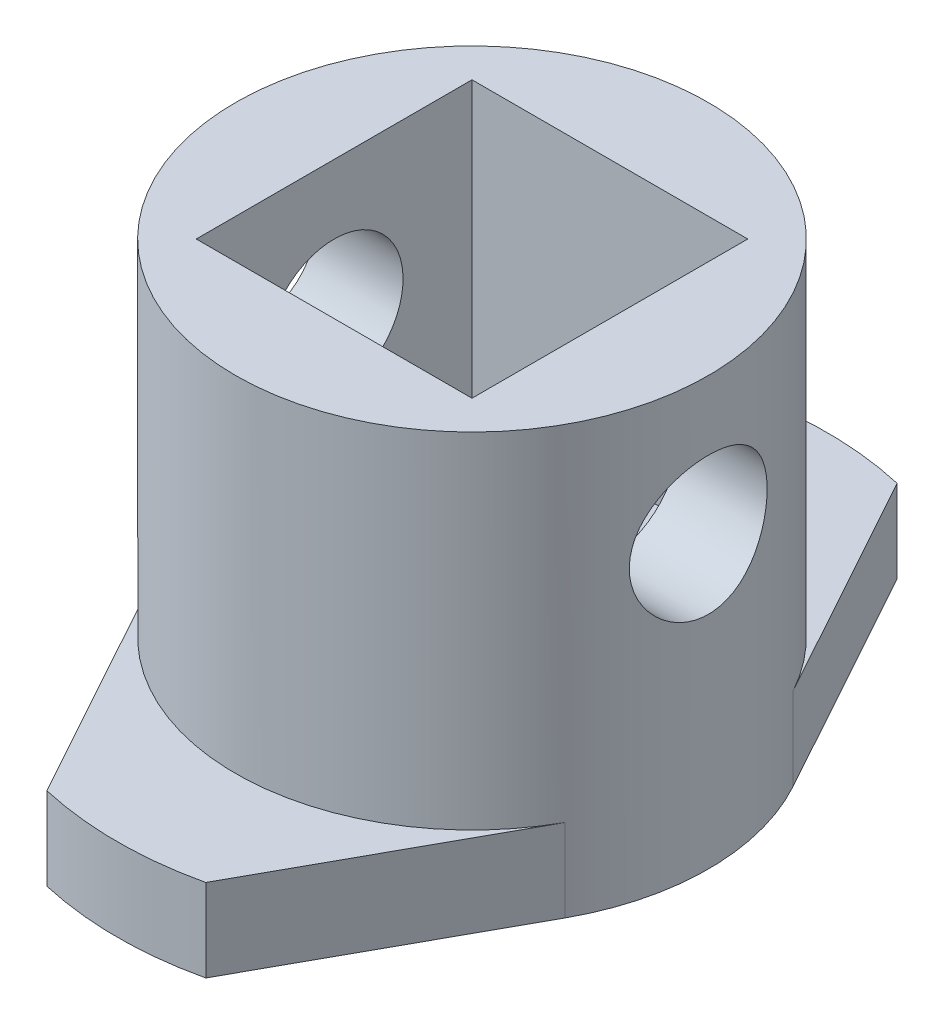
ISO-10303-21;
HEADER;
FILE_DESCRIPTION(('STEP AP214'),'2;1');
FILE_NAME('part.step','',(''),(''),'','','');
FILE_SCHEMA(('AUTOMOTIVE_DESIGN { 1 0 10303 214 1 1 1 1 }'));
ENDSEC;
DATA;
#1=APPLICATION_CONTEXT('core data for automotive mechanical design processes');
#2=APPLICATION_PROTOCOL_DEFINITION('international standard','automotive_design',2000,#1);
#3=PRODUCT_CONTEXT('',#1,'mechanical');
#4=PRODUCT('Part','Part','',(#3));
#5=PRODUCT_RELATED_PRODUCT_CATEGORY('part','',(#4));
#6=PRODUCT_DEFINITION_FORMATION('','',#4);
#7=PRODUCT_DEFINITION_CONTEXT('part definition',#1,'design');
#8=PRODUCT_DEFINITION('design','',#6,#7);
#9=PRODUCT_DEFINITION_SHAPE('','',#8);
#10=(LENGTH_UNIT() NAMED_UNIT(*) SI_UNIT(.MILLI.,.METRE.));
#11=(NAMED_UNIT(*) PLANE_ANGLE_UNIT() SI_UNIT($,.RADIAN.));
#12=(NAMED_UNIT(*) SI_UNIT($,.STERADIAN.) SOLID_ANGLE_UNIT());
#13=UNCERTAINTY_MEASURE_WITH_UNIT(LENGTH_MEASURE(1.E-05),#10,'distance_accuracy_value','');
#14=(GEOMETRIC_REPRESENTATION_CONTEXT(3) GLOBAL_UNCERTAINTY_ASSIGNED_CONTEXT((#13)) GLOBAL_UNIT_ASSIGNED_CONTEXT((#10,
#11,#12)) REPRESENTATION_CONTEXT('',''));
#15=CARTESIAN_POINT('',(0.,0.,0.));
#16=DIRECTION('',(0.,0.,1.));
#17=DIRECTION('',(1.,0.,0.));
#18=AXIS2_PLACEMENT_3D('',#15,#16,#17);
#19=CARTESIAN_POINT('',(0.,2.4,0.));
#20=DIRECTION('',(0.,1.,0.));
#21=DIRECTION('',(0.,0.,1.));
#22=AXIS2_PLACEMENT_3D('',#19,#20,#21);
#23=PLANE('',#22);
#24=CARTESIAN_POINT('',(0.,2.4,0.));
#25=DIRECTION('',(0.,1.,0.));
#26=DIRECTION('',(0.,0.,1.));
#27=AXIS2_PLACEMENT_3D('',#24,#25,#26);
#28=CIRCLE('',#27,6.86);
#29=CARTESIAN_POINT('',(6.00808554165001,2.4,-3.31096785309313));
#30=VERTEX_POINT('',#29);
#31=CARTESIAN_POINT('',(-6.00808554165001,2.4,-3.31096785309313));
#32=VERTEX_POINT('',#31);
#33=EDGE_CURVE('E11',#30,#32,#28,.T.);
#34=ORIENTED_EDGE('',*,*,#33,.F.);
#35=DIRECTION('',(-0.482648375086462,0.,-0.875814218899418));
#36=VECTOR('',#35,1.);
#37=CARTESIAN_POINT('',(6.00808554165001,2.4,-3.31096785309313));
#38=LINE('',#37,#36);
#39=CARTESIAN_POINT('',(2.30631094623362,2.4,-10.0282116959747));
#40=VERTEX_POINT('',#39);
#41=EDGE_CURVE('E112',#30,#40,#38,.T.);
#42=ORIENTED_EDGE('',*,*,#41,.T.);
#43=CARTESIAN_POINT('',(0.,2.4,0.));
#44=DIRECTION('',(0.,1.,0.));
#45=DIRECTION('',(0.,0.,1.));
#46=AXIS2_PLACEMENT_3D('',#43,#44,#45);
#47=CIRCLE('',#46,10.29);
#48=CARTESIAN_POINT('',(-2.30631094623362,2.4,-10.0282116959747));
#49=VERTEX_POINT('',#48);
#50=EDGE_CURVE('E115',#40,#49,#47,.T.);
#51=ORIENTED_EDGE('',*,*,#50,.T.);
#52=DIRECTION('',(-0.482648375086462,0.,0.875814218899418));
#53=VECTOR('',#52,1.);
#54=CARTESIAN_POINT('',(-6.00808554165001,2.4,-3.31096785309313));
#55=LINE('',#54,#53);
#56=EDGE_CURVE('E59',#49,#32,#55,.T.);
#57=ORIENTED_EDGE('',*,*,#56,.T.);
#58=EDGE_LOOP('',(#34,#42,#51,#57));
#59=FACE_BOUND('',#58,.T.);
#60=ADVANCED_FACE('F33',(#59),#23,.T.);
#61=CARTESIAN_POINT('',(-6.00808554165001,2.4,3.31096785309313));
#62=DIRECTION('',(0.875814218899418,0.,-0.482648375086462));
#63=DIRECTION('',(-0.482648375086462,0.,-0.875814218899418));
#64=AXIS2_PLACEMENT_3D('',#61,#62,#63);
#65=PLANE('',#64);
#66=DIRECTION('',(0.482648375086462,0.,0.875814218899418));
#67=VECTOR('',#66,1.);
#68=CARTESIAN_POINT('',(-6.00808554165001,0.,3.31096785309313));
#69=LINE('',#68,#67);
#70=CARTESIAN_POINT('',(-6.00808554165001,0.,3.31096785309313));
#71=VERTEX_POINT('',#70);
#72=CARTESIAN_POINT('',(-2.30631094623362,0.,10.0282116959747));
#73=VERTEX_POINT('',#72);
#74=EDGE_CURVE('E143',#71,#73,#69,.T.);
#75=ORIENTED_EDGE('',*,*,#74,.T.);
#76=DIRECTION('',(0.,-1.,0.));
#77=VECTOR('',#76,1.);
#78=CARTESIAN_POINT('',(-2.30631094623362,2.4,10.0282116959747));
#79=LINE('',#78,#77);
#80=CARTESIAN_POINT('',(-2.30631094623362,2.4,10.0282116959747));
#81=VERTEX_POINT('',#80);
#82=EDGE_CURVE('E161',#81,#73,#79,.T.);
#83=ORIENTED_EDGE('',*,*,#82,.F.);
#84=DIRECTION('',(0.482648375086462,0.,0.875814218899418));
#85=VECTOR('',#84,1.);
#86=CARTESIAN_POINT('',(-6.00808554165001,2.4,3.31096785309313));
#87=LINE('',#86,#85);
#88=CARTESIAN_POINT('',(-6.00808554165001,2.4,3.31096785309313));
#89=VERTEX_POINT('',#88);
#90=EDGE_CURVE('E156',#89,#81,#87,.T.);
#91=ORIENTED_EDGE('',*,*,#90,.F.);
#92=DIRECTION('',(0.,-1.,0.));
#93=VECTOR('',#92,1.);
#94=CARTESIAN_POINT('',(-6.00808554165001,2.4,3.31096785309313));
#95=LINE('',#94,#93);
#96=EDGE_CURVE('E165',#89,#71,#95,.T.);
#97=ORIENTED_EDGE('',*,*,#96,.T.);
#98=EDGE_LOOP('',(#75,#83,#91,#97));
#99=FACE_BOUND('',#98,.T.);
#100=ADVANCED_FACE('F35',(#99),#65,.F.);
#101=CARTESIAN_POINT('',(0.,2.4,0.));
#102=DIRECTION('',(0.,-1.,0.));
#103=DIRECTION('',(0.,0.,-1.));
#104=AXIS2_PLACEMENT_3D('',#101,#102,#103);
#105=CYLINDRICAL_SURFACE('',#104,10.29);
#106=CARTESIAN_POINT('',(0.,0.,0.));
#107=DIRECTION('',(0.,1.,0.));
#108=DIRECTION('',(0.,0.,1.));
#109=AXIS2_PLACEMENT_3D('',#106,#107,#108);
#110=CIRCLE('',#109,10.29);
#111=CARTESIAN_POINT('',(2.30631094623362,0.,10.0282116959747));
#112=VERTEX_POINT('',#111);
#113=EDGE_CURVE('E146',#73,#112,#110,.T.);
#114=ORIENTED_EDGE('',*,*,#113,.T.);
#115=DIRECTION('',(0.,-1.,0.));
#116=VECTOR('',#115,1.);
#117=CARTESIAN_POINT('',(2.30631094623362,2.4,10.0282116959747));
#118=LINE('',#117,#116);
#119=CARTESIAN_POINT('',(2.30631094623362,2.4,10.0282116959747));
#120=VERTEX_POINT('',#119);
#121=EDGE_CURVE('E158',#120,#112,#118,.T.);
#122=ORIENTED_EDGE('',*,*,#121,.F.);
#123=CARTESIAN_POINT('',(0.,2.4,0.));
#124=DIRECTION('',(0.,1.,0.));
#125=DIRECTION('',(0.,0.,1.));
#126=AXIS2_PLACEMENT_3D('',#123,#124,#125);
#127=CIRCLE('',#126,10.29);
#128=EDGE_CURVE('E138',#81,#120,#127,.T.);
#129=ORIENTED_EDGE('',*,*,#128,.F.);
#130=ORIENTED_EDGE('',*,*,#82,.T.);
#131=EDGE_LOOP('',(#114,#122,#129,#130));
#132=FACE_BOUND('',#131,.T.);
#133=ADVANCED_FACE('F195',(#132),#105,.T.);
#134=CARTESIAN_POINT('',(6.00808554165001,2.4,3.31096785309313));
#135=DIRECTION('',(-0.875814218899418,0.,-0.482648375086462));
#136=DIRECTION('',(-0.482648375086462,0.,0.875814218899418));
#137=AXIS2_PLACEMENT_3D('',#134,#135,#136);
#138=PLANE('',#137);
#139=DIRECTION('',(0.482648375086462,0.,-0.875814218899418));
#140=VECTOR('',#139,1.);
#141=CARTESIAN_POINT('',(6.00808554165001,0.,3.31096785309313));
#142=LINE('',#141,#140);
#143=CARTESIAN_POINT('',(6.00808554165001,0.,3.31096785309313));
#144=VERTEX_POINT('',#143);
#145=EDGE_CURVE('E148',#112,#144,#142,.T.);
#146=ORIENTED_EDGE('',*,*,#145,.T.);
#147=DIRECTION('',(0.,-1.,0.));
#148=VECTOR('',#147,1.);
#149=CARTESIAN_POINT('',(6.00808554165001,2.4,3.31096785309313));
#150=LINE('',#149,#148);
#151=CARTESIAN_POINT('',(6.00808554165001,2.4,3.31096785309313));
#152=VERTEX_POINT('',#151);
#153=EDGE_CURVE('E162',#152,#144,#150,.T.);
#154=ORIENTED_EDGE('',*,*,#153,.F.);
#155=DIRECTION('',(0.482648375086462,0.,-0.875814218899418));
#156=VECTOR('',#155,1.);
#157=CARTESIAN_POINT('',(6.00808554165001,2.4,3.31096785309313));
#158=LINE('',#157,#156);
#159=EDGE_CURVE('E120',#120,#152,#158,.T.);
#160=ORIENTED_EDGE('',*,*,#159,.F.);
#161=ORIENTED_EDGE('',*,*,#121,.T.);
#162=EDGE_LOOP('',(#146,#154,#160,#161));
#163=FACE_BOUND('',#162,.T.);
#164=ADVANCED_FACE('F199',(#163),#138,.F.);
#165=CARTESIAN_POINT('',(0.,2.4,0.));
#166=DIRECTION('',(0.,-1.,0.));
#167=DIRECTION('',(0.,0.,-1.));
#168=AXIS2_PLACEMENT_3D('',#165,#166,#167);
#169=CYLINDRICAL_SURFACE('',#168,6.86);
#170=CARTESIAN_POINT('',(-6.86,6.4,0.));
#171=CARTESIAN_POINT('',(-6.85999883049594,6.40000170208321,-0.109859500539845));
#172=CARTESIAN_POINT('',(-6.85733555351856,6.4090819444178,-0.219736339330891));
#173=CARTESIAN_POINT('',(-6.84697096847293,6.44508262537497,-0.436299302515542));
#174=CARTESIAN_POINT('',(-6.83926791729288,6.47200923658118,-0.542984309591592));
#175=CARTESIAN_POINT('',(-6.81966946775761,6.54273376950803,-0.750008153216511));
#176=CARTESIAN_POINT('',(-6.80778005435284,6.58650761418166,-0.850355809558806));
#177=CARTESIAN_POINT('',(-6.78105005731639,6.68958776149679,-1.04228684028245));
#178=CARTESIAN_POINT('',(-6.76620913066699,6.74889586974696,-1.13386919414742));
#179=CARTESIAN_POINT('',(-6.7347116875998,6.88306609352963,-1.30816727010669));
#180=CARTESIAN_POINT('',(-6.71801954321876,6.95827431360973,-1.39061012073112));
#181=CARTESIAN_POINT('',(-6.68491767091924,7.12137167230709,-1.54190996256044));
#182=CARTESIAN_POINT('',(-6.66850798775494,7.20926280012266,-1.61076481859418));
#183=CARTESIAN_POINT('',(-6.63745546707539,7.39750522873074,-1.73434188140094));
#184=CARTESIAN_POINT('',(-6.62285708929095,7.49807985876182,-1.78873611069195));
#185=CARTESIAN_POINT('',(-6.59761030739383,7.70744274210597,-1.87972975762875));
#186=CARTESIAN_POINT('',(-6.58696101415456,7.81622913991323,-1.91633318140761));
#187=CARTESIAN_POINT('',(-6.57118852994024,8.03587392342828,-1.96973175922049));
#188=CARTESIAN_POINT('',(-6.56592589745576,8.14660024955541,-1.98702785001897));
#189=CARTESIAN_POINT('',(-6.56110727638659,8.36949844254216,-2.00288443599287));
#190=CARTESIAN_POINT('',(-6.56154999093525,8.48166997510485,-2.00144918893592));
#191=CARTESIAN_POINT('',(-6.56796813380079,8.70024524650875,-1.98027840994713));
#192=CARTESIAN_POINT('',(-6.57375557626608,8.80671563194411,-1.96116463614855));
#193=CARTESIAN_POINT('',(-6.58990777969457,9.01486790579382,-1.9061816214333));
#194=CARTESIAN_POINT('',(-6.60027296972561,9.11654934435597,-1.87031080987752));
#195=CARTESIAN_POINT('',(-6.62456676183522,9.31378433689737,-1.78236138000631));
#196=CARTESIAN_POINT('',(-6.6385402098011,9.4092403156731,-1.73007685513056));
#197=CARTESIAN_POINT('',(-6.66845383991614,9.59023476801892,-1.61092738892858));
#198=CARTESIAN_POINT('',(-6.68439447530799,9.67577094721476,-1.54405908474624));
#199=CARTESIAN_POINT('',(-6.7172141149211,9.8380313592101,-1.39452814706775));
#200=CARTESIAN_POINT('',(-6.73410537024622,9.91427684517313,-1.31134785169998));
#201=CARTESIAN_POINT('',(-6.76636586370365,10.0518443683846,-1.13317182731352));
#202=CARTESIAN_POINT('',(-6.78173501632473,10.1131655674732,-1.03817543514601));
#203=CARTESIAN_POINT('',(-6.8093470150962,10.2194129513895,-0.838227884096056));
#204=CARTESIAN_POINT('',(-6.82157046584859,10.2642381225403,-0.733220192204095));
#205=CARTESIAN_POINT('',(-6.84137406664675,10.3354530872343,-0.516718492143073));
#206=CARTESIAN_POINT('',(-6.84895543708743,10.361847726389,-0.40522619721228));
#207=CARTESIAN_POINT('',(-6.85842985101691,10.3946673770595,-0.182994197639411));
#208=CARTESIAN_POINT('',(-6.86050778970451,10.401741743693,-0.0723581284715616));
#209=CARTESIAN_POINT('',(-6.85928078761842,10.3975330163267,0.148525015412967));
#210=CARTESIAN_POINT('',(-6.85597652181165,10.3862522241951,0.258772137168876));
#211=CARTESIAN_POINT('',(-6.84447704824795,10.3461806757107,0.473332157836286));
#212=CARTESIAN_POINT('',(-6.83638662343038,10.3177648058531,0.577721214459164));
#213=CARTESIAN_POINT('',(-6.81624555336654,10.2446766026032,0.780231159112765));
#214=CARTESIAN_POINT('',(-6.80419444239787,10.2000023573826,0.878351308384554));
#215=CARTESIAN_POINT('',(-6.77705238740948,10.0945457377524,1.06796299576584));
#216=CARTESIAN_POINT('',(-6.76189974323467,10.0334269052431,1.15925834023597));
#217=CARTESIAN_POINT('',(-6.73029811691574,9.89722847227506,1.33052014585505));
#218=CARTESIAN_POINT('',(-6.71384882822,9.82214556470327,1.41048391542548));
#219=CARTESIAN_POINT('',(-6.68080562199139,9.65710327345005,1.55964055960439));
#220=CARTESIAN_POINT('',(-6.664225956902,9.56672334195329,1.62837222015558));
#221=CARTESIAN_POINT('',(-6.63340141087968,9.37535359640693,1.74971990267175));
#222=CARTESIAN_POINT('',(-6.61915645598731,9.27436411861516,1.80233643518108));
#223=CARTESIAN_POINT('',(-6.59478004556162,9.0650248295832,1.88958475163939));
#224=CARTESIAN_POINT('',(-6.58462779928164,8.95671556875015,1.92430769132777));
#225=CARTESIAN_POINT('',(-6.56962402036333,8.73543965822319,1.97493057487497));
#226=CARTESIAN_POINT('',(-6.56477079807533,8.62247450503936,1.99083651886639));
#227=CARTESIAN_POINT('',(-6.56107454034379,8.3998656965441,2.0029817684134));
#228=CARTESIAN_POINT('',(-6.56200263228372,8.29026614592327,1.99996995604944));
#229=CARTESIAN_POINT('',(-6.56921794050083,8.07320924889446,1.9761394827265));
#230=CARTESIAN_POINT('',(-6.57550496391254,7.96575182553474,1.95532146260466));
#231=CARTESIAN_POINT('',(-6.592580586492,7.75717899551059,1.89694064205664));
#232=CARTESIAN_POINT('',(-6.60331860533165,7.65600657034638,1.85956567385598));
#233=CARTESIAN_POINT('',(-6.62807956585641,7.46128800064405,1.76927745324158));
#234=CARTESIAN_POINT('',(-6.64210310840908,7.36774325530496,1.71636135816526));
#235=CARTESIAN_POINT('',(-6.67246112533849,7.18743367293715,1.59434597997061));
#236=CARTESIAN_POINT('',(-6.68885879728252,7.10101568322366,1.52474984833368));
#237=CARTESIAN_POINT('',(-6.72179921007291,6.9408421527199,1.37225753940549));
#238=CARTESIAN_POINT('',(-6.73834198683339,6.86708984534129,1.28935797630994));
#239=CARTESIAN_POINT('',(-6.77024537421489,6.73235769469749,1.1099070750086));
#240=CARTESIAN_POINT('',(-6.78556185117065,6.67177772835591,1.01304688612276));
#241=CARTESIAN_POINT('',(-6.81277062675103,6.56785063970784,0.810069636728331));
#242=CARTESIAN_POINT('',(-6.82466468833596,6.52449464056547,0.703957379000947));
#243=CARTESIAN_POINT('',(-6.84251585970039,6.46060807172218,0.498852378551981));
#244=CARTESIAN_POINT('',(-6.84901997467694,6.43793920673813,0.400568750606854));
#245=CARTESIAN_POINT('',(-6.85776226853686,6.40763549214577,0.201528034682685));
#246=CARTESIAN_POINT('',(-6.86000107275618,6.39999843872258,0.100771311477671));
#247=CARTESIAN_POINT('',(-6.86,6.4,0.));
#248=B_SPLINE_CURVE_WITH_KNOTS('',3,(#170,#171,#172,#173,#174,#175,#176,#177,#178,#179,#180,
#181,#182,#183,#184,#185,#186,#187,#188,#189,#190,#191,#192,#193,#194,#195,#196,#197,#198,#199,
#200,#201,#202,#203,#204,#205,#206,#207,#208,#209,#210,#211,#212,#213,#214,#215,#216,#217,#218,
#219,#220,#221,#222,#223,#224,#225,#226,#227,#228,#229,#230,#231,#232,#233,#234,#235,#236,#237,
#238,#239,#240,#241,#242,#243,#244,#245,#246,#247),.UNSPECIFIED.,.T.,.F.,(4,2,2,2,2,2,2,2,2,2,2,
2,2,2,2,2,2,2,2,2,2,2,2,2,2,2,2,2,2,2,2,2,2,2,2,2,2,2,4),(0.,0.329208506613839,
0.658530937143522,0.987384457230029,1.31627621823262,1.65324224111139,1.99026117159376,
2.33437386488657,2.67840903495245,3.01329410402005,3.34810305263214,3.67156690831194,
3.99506108838167,4.322787535351,4.65058963241644,4.99128126306182,5.33199202280589,
5.67475571835032,6.0174292631754,6.34843493771767,6.67939910497759,7.00337249564377,
7.32738399477743,7.65860862261329,7.98991179452655,8.33253167289279,8.67514069557507,
9.0159866605088,9.3567239113457,9.68406001638425,10.0113843412444,10.335086776919,
10.6588484586508,10.9938189983649,11.3288749257208,11.6730024506222,12.0169523893236,
12.3189712190953,12.6209457665678),.UNSPECIFIED.);
#249=CARTESIAN_POINT('',(-6.86,6.4,0.));
#250=VERTEX_POINT('',#249);
#251=EDGE_CURVE('E243',#250,#250,#248,.T.);
#252=ORIENTED_EDGE('',*,*,#251,.T.);
#253=EDGE_LOOP('',(#252));
#254=FACE_BOUND('',#253,.T.);
#255=CARTESIAN_POINT('',(6.56198140808095,8.4,-2.));
#256=CARTESIAN_POINT('',(6.56198279508693,8.29025248359205,-1.99999825934634));
#257=CARTESIAN_POINT('',(6.56476478331815,8.18048756982026,-1.99093586872349));
#258=CARTESIAN_POINT('',(6.57555071304502,7.96415652791233,-1.95501251512529));
#259=CARTESIAN_POINT('',(6.58355662427376,7.85759162223206,-1.92814483842666));
#260=CARTESIAN_POINT('',(6.60380828079639,7.65082287036188,-1.85759246093011));
#261=CARTESIAN_POINT('',(6.61604726272348,7.55060917696558,-1.81393457422156));
#262=CARTESIAN_POINT('',(6.64337702769154,7.35890609271384,-1.7111281891805));
#263=CARTESIAN_POINT('',(6.65846818530935,7.26741785015092,-1.6519776558013));
#264=CARTESIAN_POINT('',(6.69030765930938,7.09302842547102,-1.51797284757608));
#265=CARTESIAN_POINT('',(6.70708976780439,7.01042659767143,-1.4427369450576));
#266=CARTESIAN_POINT('',(6.7401307849516,6.85881571934041,-1.27951568907915));
#267=CARTESIAN_POINT('',(6.75638962977346,6.78980832190768,-1.19152878733777));
#268=CARTESIAN_POINT('',(6.78693426076251,6.66605894706066,-1.00318777683047));
#269=CARTESIAN_POINT('',(6.80117557410895,6.61162018687757,-0.902626596756638));
#270=CARTESIAN_POINT('',(6.82568921827488,6.52054065875158,-0.693291928903939));
#271=CARTESIAN_POINT('',(6.83596235513162,6.48389627593028,-0.58452011428478));
#272=CARTESIAN_POINT('',(6.85114308639929,6.43043059083241,-0.364981833986648));
#273=CARTESIAN_POINT('',(6.85618860358972,6.41309876779287,-0.254349407016796));
#274=CARTESIAN_POINT('',(6.86083039645993,6.3971380505262,-0.0316396770830241));
#275=CARTESIAN_POINT('',(6.86042775518283,6.39850543907067,0.0804373342854212));
#276=CARTESIAN_POINT('',(6.85431703538807,6.41955719562886,0.299280694572664));
#277=CARTESIAN_POINT('',(6.84876899126908,6.4386890667512,0.406105358019941));
#278=CARTESIAN_POINT('',(6.83318384070052,6.49382682928158,0.614956200315153));
#279=CARTESIAN_POINT('',(6.82314645637932,6.52983376519305,0.716982081706222));
#280=CARTESIAN_POINT('',(6.79948496373491,6.61808643374439,0.91467800677452));
#281=CARTESIAN_POINT('',(6.78582184471576,6.67050997624847,1.01026381371397));
#282=CARTESIAN_POINT('',(6.75636429602014,6.78996828167308,1.19146154082247));
#283=CARTESIAN_POINT('',(6.74056938381402,6.85700635470039,1.27707119469866));
#284=CARTESIAN_POINT('',(6.70786412982928,7.00667451108334,1.43918457678466));
#285=CARTESIAN_POINT('',(6.69093411721483,7.08978426890237,1.51524206096471));
#286=CARTESIAN_POINT('',(6.65837494385248,7.26774722479277,1.65246177554388));
#287=CARTESIAN_POINT('',(6.64274589797113,7.36260145798647,1.71362269159322));
#288=CARTESIAN_POINT('',(6.61446791584007,7.5624802752451,1.81974430798628));
#289=CARTESIAN_POINT('',(6.60184580515747,7.66758541585522,1.86456094689517));
#290=CARTESIAN_POINT('',(6.58133223726724,7.88430270256145,1.93573071778325));
#291=CARTESIAN_POINT('',(6.57343933714113,7.99591285251359,1.96208948181639));
#292=CARTESIAN_POINT('',(6.56359214729927,8.21824397843596,1.99477847212781));
#293=CARTESIAN_POINT('',(6.5614378071197,8.32885693732079,2.00178371378792));
#294=CARTESIAN_POINT('',(6.56275999147695,8.54967877313027,1.99744522977691));
#295=CARTESIAN_POINT('',(6.56623577952492,8.65988770101697,1.98610390405889));
#296=CARTESIAN_POINT('',(6.5782310353819,8.87401541751867,1.94599388164325));
#297=CARTESIAN_POINT('',(6.58662682428254,8.97802180816306,1.91765214236042));
#298=CARTESIAN_POINT('',(6.60738986671663,9.17979866298297,1.84483687017682));
#299=CARTESIAN_POINT('',(6.61975770974252,9.27756819896391,1.80036094267465));
#300=CARTESIAN_POINT('',(6.64746518515423,9.46686219712568,1.69523599846957));
#301=CARTESIAN_POINT('',(6.66287278338087,9.55816274281596,1.63420213750901));
#302=CARTESIAN_POINT('',(6.69477416944742,9.72947310706513,1.49815606050454));
#303=CARTESIAN_POINT('',(6.71126820207072,9.80948036829579,1.42314068728712));
#304=CARTESIAN_POINT('',(6.74418985636343,9.95884553299203,1.25810081965091));
#305=CARTESIAN_POINT('',(6.76059450909466,10.0277268705448,1.1676394149912));
#306=CARTESIAN_POINT('',(6.79089884135584,10.1493387231849,0.976055520395959));
#307=CARTESIAN_POINT('',(6.80479864967317,10.2020700687269,0.87493357899928));
#308=CARTESIAN_POINT('',(6.82843987063417,10.2893785002119,0.665588503880117));
#309=CARTESIAN_POINT('',(6.83821255979332,10.3240926036001,0.55742622269682));
#310=CARTESIAN_POINT('',(6.85263659794952,10.3747470511479,0.336469381281796));
#311=CARTESIAN_POINT('',(6.85728932355175,10.3906924417337,0.223676074659005));
#312=CARTESIAN_POINT('',(6.86087029893611,10.4029905377162,0.0010751392680664));
#313=CARTESIAN_POINT('',(6.86000105043763,10.4000363010625,-0.10869143450898));
#314=CARTESIAN_POINT('',(6.85310793238822,10.3762632317467,-0.326098199119176));
#315=CARTESIAN_POINT('',(6.84708432763781,10.3554453168152,-0.433738498897144));
#316=CARTESIAN_POINT('',(6.83061264317419,10.2969558362878,-0.642833085979084));
#317=CARTESIAN_POINT('',(6.82020780309026,10.259448780583,-0.744337028745085));
#318=CARTESIAN_POINT('',(6.79605207754348,10.1687922716267,-0.939666198280442));
#319=CARTESIAN_POINT('',(6.78230066058764,10.1156403334223,-1.03349020217957));
#320=CARTESIAN_POINT('',(6.75237885922029,9.99331002086553,-1.21392128667451));
#321=CARTESIAN_POINT('',(6.73614722606064,9.92369015944661,-1.30021881595139));
#322=CARTESIAN_POINT('',(6.70330311323447,9.77120628375402,-1.46013887562784));
#323=CARTESIAN_POINT('',(6.68669052770367,9.68833854882051,-1.53375783315435));
#324=CARTESIAN_POINT('',(6.65442708314388,9.50895663491348,-1.66827043772383));
#325=CARTESIAN_POINT('',(6.63881556711335,9.41212824239477,-1.72875549496918));
#326=CARTESIAN_POINT('',(6.61093037795607,9.20923597200506,-1.83251287633846));
#327=CARTESIAN_POINT('',(6.59865494253285,9.103177009463,-1.87579429395812));
#328=CARTESIAN_POINT('',(6.58017803290103,8.89824479924409,-1.93954062726417));
#329=CARTESIAN_POINT('',(6.57341622697087,8.80008579415335,-1.96215298335573));
#330=CARTESIAN_POINT('',(6.56431766370279,8.60128911402962,-1.99238216266096));
#331=CARTESIAN_POINT('',(6.56198013602709,8.50065187358891,-2.00000159639196));
#332=CARTESIAN_POINT('',(6.56198140808095,8.4,-2.));
#333=B_SPLINE_CURVE_WITH_KNOTS('',3,(#255,#256,#257,#258,#259,#260,#261,#262,#263,#264,#265,
#266,#267,#268,#269,#270,#271,#272,#273,#274,#275,#276,#277,#278,#279,#280,#281,#282,#283,#284,
#285,#286,#287,#288,#289,#290,#291,#292,#293,#294,#295,#296,#297,#298,#299,#300,#301,#302,#303,
#304,#305,#306,#307,#308,#309,#310,#311,#312,#313,#314,#315,#316,#317,#318,#319,#320,#321,#322,
#323,#324,#325,#326,#327,#328,#329,#330,#331,#332),.UNSPECIFIED.,.T.,.F.,(4,2,2,2,2,2,2,2,2,2,2,
2,2,2,2,2,2,2,2,2,2,2,2,2,2,2,2,2,2,2,2,2,2,2,2,2,2,2,4),(0.,0.328871582333219,
0.657867240742356,0.98633965791816,1.31485524345962,1.65226038265035,1.98970652541124,
2.33370900996254,2.6776415820974,3.01224919896764,3.34679029993994,3.67126322396345,
3.99575623430118,4.32389307225745,4.65210430867199,4.99229149912116,5.33250869400605,
5.6756560184845,6.01869859269346,6.34961564911497,6.68048942108001,7.00338231271471,
7.32632314703586,7.65753035845848,7.9888124507878,8.33180805170082,8.67478601235125,
9.01511599988805,9.35535446048799,9.68318957398515,10.0110078462536,10.3356639346938,
10.660371617696,10.9950369047093,11.3297963479862,11.6738208896348,12.0176633442797,
12.3193312731667,12.6209466719967),.UNSPECIFIED.);
#334=CARTESIAN_POINT('',(6.56198140808095,8.4,-2.));
#335=VERTEX_POINT('',#334);
#336=EDGE_CURVE('E237',#335,#335,#333,.T.);
#337=ORIENTED_EDGE('',*,*,#336,.T.);
#338=EDGE_LOOP('',(#337));
#339=FACE_BOUND('',#338,.T.);
#340=CARTESIAN_POINT('',(0.,0.,0.));
#341=DIRECTION('',(0.,1.,0.));
#342=DIRECTION('',(0.,0.,1.));
#343=AXIS2_PLACEMENT_3D('',#340,#341,#342);
#344=CIRCLE('',#343,6.86);
#345=CARTESIAN_POINT('',(6.00808554165001,0.,-3.31096785309313));
#346=VERTEX_POINT('',#345);
#347=EDGE_CURVE('E150',#144,#346,#344,.T.);
#348=ORIENTED_EDGE('',*,*,#347,.T.);
#349=DIRECTION('',(0.,-1.,0.));
#350=VECTOR('',#349,1.);
#351=CARTESIAN_POINT('',(6.00808554165001,2.4,-3.31096785309313));
#352=LINE('',#351,#350);
#353=EDGE_CURVE('E129',#30,#346,#352,.T.);
#354=ORIENTED_EDGE('',*,*,#353,.F.);
#355=ORIENTED_EDGE('',*,*,#33,.T.);
#356=DIRECTION('',(0.,-1.,0.));
#357=VECTOR('',#356,1.);
#358=CARTESIAN_POINT('',(-6.00808554165001,2.4,-3.31096785309313));
#359=LINE('',#358,#357);
#360=CARTESIAN_POINT('',(-6.00808554165001,0.,-3.31096785309313));
#361=VERTEX_POINT('',#360);
#362=EDGE_CURVE('E134',#32,#361,#359,.T.);
#363=ORIENTED_EDGE('',*,*,#362,.T.);
#364=CARTESIAN_POINT('',(0.,0.,0.));
#365=DIRECTION('',(0.,1.,0.));
#366=DIRECTION('',(0.,0.,1.));
#367=AXIS2_PLACEMENT_3D('',#364,#365,#366);
#368=CIRCLE('',#367,6.86);
#369=EDGE_CURVE('E140',#361,#71,#368,.T.);
#370=ORIENTED_EDGE('',*,*,#369,.T.);
#371=ORIENTED_EDGE('',*,*,#96,.F.);
#372=EDGE_CURVE('E42',#89,#152,#28,.T.);
#373=ORIENTED_EDGE('',*,*,#372,.T.);
#374=ORIENTED_EDGE('',*,*,#153,.T.);
#375=EDGE_LOOP('',(#348,#354,#355,#363,#370,#371,#373,#374));
#376=FACE_BOUND('',#375,.T.);
#377=CARTESIAN_POINT('',(0.,12.4,0.));
#378=DIRECTION('',(0.,1.,0.));
#379=DIRECTION('',(0.,0.,1.));
#380=AXIS2_PLACEMENT_3D('',#377,#378,#379);
#381=CIRCLE('',#380,6.86);
#382=CARTESIAN_POINT('',(0.,12.4,6.86));
#383=VERTEX_POINT('',#382);
#384=EDGE_CURVE('E144',#383,#383,#381,.T.);
#385=ORIENTED_EDGE('',*,*,#384,.F.);
#386=EDGE_LOOP('',(#385));
#387=FACE_BOUND('',#386,.T.);
#388=ADVANCED_FACE('F186',(#254,#339,#376,#387),#169,.T.);
#389=CARTESIAN_POINT('',(6.00808554165001,2.4,-3.31096785309313));
#390=DIRECTION('',(-0.875814218899418,0.,0.482648375086462));
#391=DIRECTION('',(0.482648375086462,0.,0.875814218899418));
#392=AXIS2_PLACEMENT_3D('',#389,#390,#391);
#393=PLANE('',#392);
#394=DIRECTION('',(-0.482648375086462,0.,-0.875814218899418));
#395=VECTOR('',#394,1.);
#396=CARTESIAN_POINT('',(6.00808554165001,0.,-3.31096785309313));
#397=LINE('',#396,#395);
#398=CARTESIAN_POINT('',(2.30631094623362,0.,-10.0282116959747));
#399=VERTEX_POINT('',#398);
#400=EDGE_CURVE('E126',#346,#399,#397,.T.);
#401=ORIENTED_EDGE('',*,*,#400,.T.);
#402=DIRECTION('',(0.,-1.,0.));
#403=VECTOR('',#402,1.);
#404=CARTESIAN_POINT('',(2.30631094623362,2.4,-10.0282116959747));
#405=LINE('',#404,#403);
#406=EDGE_CURVE('E123',#40,#399,#405,.T.);
#407=ORIENTED_EDGE('',*,*,#406,.F.);
#408=ORIENTED_EDGE('',*,*,#41,.F.);
#409=ORIENTED_EDGE('',*,*,#353,.T.);
#410=EDGE_LOOP('',(#401,#407,#408,#409));
#411=FACE_BOUND('',#410,.T.);
#412=ADVANCED_FACE('F124',(#411),#393,.F.);
#413=CARTESIAN_POINT('',(0.,2.4,0.));
#414=DIRECTION('',(0.,-1.,0.));
#415=DIRECTION('',(0.,0.,-1.));
#416=AXIS2_PLACEMENT_3D('',#413,#414,#415);
#417=CYLINDRICAL_SURFACE('',#416,10.29);
#418=CARTESIAN_POINT('',(0.,0.,0.));
#419=DIRECTION('',(0.,1.,0.));
#420=DIRECTION('',(0.,0.,1.));
#421=AXIS2_PLACEMENT_3D('',#418,#419,#420);
#422=CIRCLE('',#421,10.29);
#423=CARTESIAN_POINT('',(-2.30631094623362,0.,-10.0282116959747));
#424=VERTEX_POINT('',#423);
#425=EDGE_CURVE('E153',#399,#424,#422,.T.);
#426=ORIENTED_EDGE('',*,*,#425,.T.);
#427=DIRECTION('',(0.,-1.,0.));
#428=VECTOR('',#427,1.);
#429=CARTESIAN_POINT('',(-2.30631094623362,2.4,-10.0282116959747));
#430=LINE('',#429,#428);
#431=EDGE_CURVE('E130',#49,#424,#430,.T.);
#432=ORIENTED_EDGE('',*,*,#431,.F.);
#433=ORIENTED_EDGE('',*,*,#50,.F.);
#434=ORIENTED_EDGE('',*,*,#406,.T.);
#435=EDGE_LOOP('',(#426,#432,#433,#434));
#436=FACE_BOUND('',#435,.T.);
#437=ADVANCED_FACE('F132',(#436),#417,.T.);
#438=CARTESIAN_POINT('',(-6.00808554165001,2.4,-3.31096785309313));
#439=DIRECTION('',(0.875814218899418,0.,0.482648375086462));
#440=DIRECTION('',(0.482648375086462,0.,-0.875814218899418));
#441=AXIS2_PLACEMENT_3D('',#438,#439,#440);
#442=PLANE('',#441);
#443=DIRECTION('',(-0.482648375086462,0.,0.875814218899418));
#444=VECTOR('',#443,1.);
#445=CARTESIAN_POINT('',(-6.00808554165001,0.,-3.31096785309313));
#446=LINE('',#445,#444);
#447=EDGE_CURVE('E92',#424,#361,#446,.T.);
#448=ORIENTED_EDGE('',*,*,#447,.T.);
#449=ORIENTED_EDGE('',*,*,#362,.F.);
#450=ORIENTED_EDGE('',*,*,#56,.F.);
#451=ORIENTED_EDGE('',*,*,#431,.T.);
#452=EDGE_LOOP('',(#448,#449,#450,#451));
#453=FACE_BOUND('',#452,.T.);
#454=ADVANCED_FACE('F205',(#453),#442,.F.);
#455=ORIENTED_EDGE('',*,*,#372,.F.);
#456=ORIENTED_EDGE('',*,*,#90,.T.);
#457=ORIENTED_EDGE('',*,*,#128,.T.);
#458=ORIENTED_EDGE('',*,*,#159,.T.);
#459=EDGE_LOOP('',(#455,#456,#457,#458));
#460=FACE_BOUND('',#459,.T.);
#461=ADVANCED_FACE('F203',(#460),#23,.T.);
#462=CARTESIAN_POINT('',(0.,0.,0.));
#463=DIRECTION('',(0.,1.,0.));
#464=DIRECTION('',(0.,0.,1.));
#465=AXIS2_PLACEMENT_3D('',#462,#463,#464);
#466=PLANE('',#465);
#467=ORIENTED_EDGE('',*,*,#369,.F.);
#468=ORIENTED_EDGE('',*,*,#447,.F.);
#469=ORIENTED_EDGE('',*,*,#425,.F.);
#470=ORIENTED_EDGE('',*,*,#400,.F.);
#471=ORIENTED_EDGE('',*,*,#347,.F.);
#472=ORIENTED_EDGE('',*,*,#145,.F.);
#473=ORIENTED_EDGE('',*,*,#113,.F.);
#474=ORIENTED_EDGE('',*,*,#74,.F.);
#475=EDGE_LOOP('',(#467,#468,#469,#470,#471,#472,#473,#474));
#476=FACE_BOUND('',#475,.T.);
#477=ADVANCED_FACE('F189',(#476),#466,.F.);
#478=CARTESIAN_POINT('',(0.,12.4,0.));
#479=DIRECTION('',(0.,1.,0.));
#480=DIRECTION('',(0.,0.,1.));
#481=AXIS2_PLACEMENT_3D('',#478,#479,#480);
#482=PLANE('',#481);
#483=DIRECTION('',(0.,0.,-1.));
#484=VECTOR('',#483,1.);
#485=CARTESIAN_POINT('',(4.,12.4,-4.));
#486=LINE('',#485,#484);
#487=CARTESIAN_POINT('',(4.,12.4,4.));
#488=VERTEX_POINT('',#487);
#489=CARTESIAN_POINT('',(4.,12.4,-4.));
#490=VERTEX_POINT('',#489);
#491=EDGE_CURVE('E50',#488,#490,#486,.T.);
#492=ORIENTED_EDGE('',*,*,#491,.F.);
#493=DIRECTION('',(1.,0.,0.));
#494=VECTOR('',#493,1.);
#495=CARTESIAN_POINT('',(-4.,12.4,4.));
#496=LINE('',#495,#494);
#497=CARTESIAN_POINT('',(-4.,12.4,4.));
#498=VERTEX_POINT('',#497);
#499=EDGE_CURVE('E297',#498,#488,#496,.T.);
#500=ORIENTED_EDGE('',*,*,#499,.F.);
#501=DIRECTION('',(0.,0.,1.));
#502=VECTOR('',#501,1.);
#503=CARTESIAN_POINT('',(-4.,12.4,-4.));
#504=LINE('',#503,#502);
#505=CARTESIAN_POINT('',(-4.,12.4,-4.));
#506=VERTEX_POINT('',#505);
#507=EDGE_CURVE('E300',#506,#498,#504,.T.);
#508=ORIENTED_EDGE('',*,*,#507,.F.);
#509=DIRECTION('',(-1.,0.,0.));
#510=VECTOR('',#509,1.);
#511=CARTESIAN_POINT('',(-4.,12.4,-4.));
#512=LINE('',#511,#510);
#513=EDGE_CURVE('E303',#490,#506,#512,.T.);
#514=ORIENTED_EDGE('',*,*,#513,.F.);
#515=EDGE_LOOP('',(#492,#500,#508,#514));
#516=FACE_BOUND('',#515,.T.);
#517=ORIENTED_EDGE('',*,*,#384,.T.);
#518=EDGE_LOOP('',(#517));
#519=FACE_BOUND('',#518,.T.);
#520=ADVANCED_FACE('F212',(#516,#519),#482,.T.);
#521=CARTESIAN_POINT('',(4.,4.4,-4.));
#522=DIRECTION('',(1.,0.,0.));
#523=DIRECTION('',(0.,0.,-1.));
#524=AXIS2_PLACEMENT_3D('',#521,#522,#523);
#525=PLANE('',#524);
#526=CARTESIAN_POINT('',(4.,8.4,0.));
#527=DIRECTION('',(1.,0.,0.));
#528=DIRECTION('',(0.,0.,-1.));
#529=AXIS2_PLACEMENT_3D('',#526,#527,#528);
#530=CIRCLE('',#529,2.);
#531=CARTESIAN_POINT('',(4.,8.4,-2.));
#532=VERTEX_POINT('',#531);
#533=EDGE_CURVE('E444',#532,#532,#530,.T.);
#534=ORIENTED_EDGE('',*,*,#533,.T.);
#535=EDGE_LOOP('',(#534));
#536=FACE_BOUND('',#535,.T.);
#537=ORIENTED_EDGE('',*,*,#491,.T.);
#538=DIRECTION('',(0.,1.,0.));
#539=VECTOR('',#538,1.);
#540=CARTESIAN_POINT('',(4.,4.4,-4.));
#541=LINE('',#540,#539);
#542=CARTESIAN_POINT('',(4.,4.4,-4.));
#543=VERTEX_POINT('',#542);
#544=EDGE_CURVE('E289',#543,#490,#541,.T.);
#545=ORIENTED_EDGE('',*,*,#544,.F.);
#546=DIRECTION('',(0.,0.,-1.));
#547=VECTOR('',#546,1.);
#548=CARTESIAN_POINT('',(4.,4.4,-4.));
#549=LINE('',#548,#547);
#550=CARTESIAN_POINT('',(4.,4.4,4.));
#551=VERTEX_POINT('',#550);
#552=EDGE_CURVE('E248',#551,#543,#549,.T.);
#553=ORIENTED_EDGE('',*,*,#552,.F.);
#554=DIRECTION('',(0.,1.,0.));
#555=VECTOR('',#554,1.);
#556=CARTESIAN_POINT('',(4.,4.4,4.));
#557=LINE('',#556,#555);
#558=EDGE_CURVE('E285',#551,#488,#557,.T.);
#559=ORIENTED_EDGE('',*,*,#558,.T.);
#560=EDGE_LOOP('',(#537,#545,#553,#559));
#561=FACE_BOUND('',#560,.T.);
#562=ADVANCED_FACE('F266',(#536,#561),#525,.F.);
#563=CARTESIAN_POINT('',(-4.,4.4,4.));
#564=DIRECTION('',(0.,0.,1.));
#565=DIRECTION('',(1.,0.,0.));
#566=AXIS2_PLACEMENT_3D('',#563,#564,#565);
#567=PLANE('',#566);
#568=ORIENTED_EDGE('',*,*,#499,.T.);
#569=ORIENTED_EDGE('',*,*,#558,.F.);
#570=DIRECTION('',(1.,0.,0.));
#571=VECTOR('',#570,1.);
#572=CARTESIAN_POINT('',(-4.,4.4,4.));
#573=LINE('',#572,#571);
#574=CARTESIAN_POINT('',(-4.,4.4,4.));
#575=VERTEX_POINT('',#574);
#576=EDGE_CURVE('E292',#575,#551,#573,.T.);
#577=ORIENTED_EDGE('',*,*,#576,.F.);
#578=DIRECTION('',(0.,1.,0.));
#579=VECTOR('',#578,1.);
#580=CARTESIAN_POINT('',(-4.,4.4,4.));
#581=LINE('',#580,#579);
#582=EDGE_CURVE('E286',#575,#498,#581,.T.);
#583=ORIENTED_EDGE('',*,*,#582,.T.);
#584=EDGE_LOOP('',(#568,#569,#577,#583));
#585=FACE_BOUND('',#584,.T.);
#586=ADVANCED_FACE('F262',(#585),#567,.F.);
#587=CARTESIAN_POINT('',(-4.,4.4,-4.));
#588=DIRECTION('',(-1.,0.,0.));
#589=DIRECTION('',(0.,0.,1.));
#590=AXIS2_PLACEMENT_3D('',#587,#588,#589);
#591=PLANE('',#590);
#592=CARTESIAN_POINT('',(-4.,8.4,0.));
#593=DIRECTION('',(-1.,0.,0.));
#594=DIRECTION('',(0.,0.,1.));
#595=AXIS2_PLACEMENT_3D('',#592,#593,#594);
#596=CIRCLE('',#595,2.);
#597=CARTESIAN_POINT('',(-4.,8.4,2.));
#598=VERTEX_POINT('',#597);
#599=EDGE_CURVE('E37',#598,#598,#596,.T.);
#600=ORIENTED_EDGE('',*,*,#599,.T.);
#601=EDGE_LOOP('',(#600));
#602=FACE_BOUND('',#601,.T.);
#603=ORIENTED_EDGE('',*,*,#507,.T.);
#604=ORIENTED_EDGE('',*,*,#582,.F.);
#605=DIRECTION('',(0.,0.,1.));
#606=VECTOR('',#605,1.);
#607=CARTESIAN_POINT('',(-4.,4.4,-4.));
#608=LINE('',#607,#606);
#609=CARTESIAN_POINT('',(-4.,4.4,-4.));
#610=VERTEX_POINT('',#609);
#611=EDGE_CURVE('E309',#610,#575,#608,.T.);
#612=ORIENTED_EDGE('',*,*,#611,.F.);
#613=DIRECTION('',(0.,1.,0.));
#614=VECTOR('',#613,1.);
#615=CARTESIAN_POINT('',(-4.,4.4,-4.));
#616=LINE('',#615,#614);
#617=EDGE_CURVE('E291',#610,#506,#616,.T.);
#618=ORIENTED_EDGE('',*,*,#617,.T.);
#619=EDGE_LOOP('',(#603,#604,#612,#618));
#620=FACE_BOUND('',#619,.T.);
#621=ADVANCED_FACE('F265',(#602,#620),#591,.F.);
#622=CARTESIAN_POINT('',(-4.,4.4,-4.));
#623=DIRECTION('',(0.,0.,-1.));
#624=DIRECTION('',(-1.,0.,0.));
#625=AXIS2_PLACEMENT_3D('',#622,#623,#624);
#626=PLANE('',#625);
#627=ORIENTED_EDGE('',*,*,#513,.T.);
#628=ORIENTED_EDGE('',*,*,#617,.F.);
#629=DIRECTION('',(-1.,0.,0.));
#630=VECTOR('',#629,1.);
#631=CARTESIAN_POINT('',(-4.,4.4,-4.));
#632=LINE('',#631,#630);
#633=EDGE_CURVE('E311',#543,#610,#632,.T.);
#634=ORIENTED_EDGE('',*,*,#633,.F.);
#635=ORIENTED_EDGE('',*,*,#544,.T.);
#636=EDGE_LOOP('',(#627,#628,#634,#635));
#637=FACE_BOUND('',#636,.T.);
#638=ADVANCED_FACE('F260',(#637),#626,.F.);
#639=CARTESIAN_POINT('',(0.,4.4,0.));
#640=DIRECTION('',(0.,1.,0.));
#641=DIRECTION('',(0.,0.,1.));
#642=AXIS2_PLACEMENT_3D('',#639,#640,#641);
#643=PLANE('',#642);
#644=ORIENTED_EDGE('',*,*,#552,.T.);
#645=ORIENTED_EDGE('',*,*,#633,.T.);
#646=ORIENTED_EDGE('',*,*,#611,.T.);
#647=ORIENTED_EDGE('',*,*,#576,.T.);
#648=EDGE_LOOP('',(#644,#645,#646,#647));
#649=FACE_BOUND('',#648,.T.);
#650=ADVANCED_FACE('F255',(#649),#643,.T.);
#651=CARTESIAN_POINT('',(-6.86,8.4,0.));
#652=DIRECTION('',(1.,0.,0.));
#653=DIRECTION('',(0.,0.,-1.));
#654=AXIS2_PLACEMENT_3D('',#651,#652,#653);
#655=CYLINDRICAL_SURFACE('',#654,2.);
#656=ORIENTED_EDGE('',*,*,#599,.F.);
#657=EDGE_LOOP('',(#656));
#658=FACE_BOUND('',#657,.T.);
#659=ORIENTED_EDGE('',*,*,#251,.F.);
#660=EDGE_LOOP('',(#659));
#661=FACE_BOUND('',#660,.T.);
#662=ADVANCED_FACE('F250',(#658,#661),#655,.F.);
#663=ORIENTED_EDGE('',*,*,#533,.F.);
#664=EDGE_LOOP('',(#663));
#665=FACE_BOUND('',#664,.T.);
#666=ORIENTED_EDGE('',*,*,#336,.F.);
#667=EDGE_LOOP('',(#666));
#668=FACE_BOUND('',#667,.T.);
#669=ADVANCED_FACE('F254',(#665,#668),#655,.F.);
#670=CLOSED_SHELL('',(#60,#100,#133,#164,#388,#412,#437,#454,#461,#477,#520,#562,#586,#621,#638,
#650,#662,#669));
#671=MANIFOLD_SOLID_BREP('B2',#670);
#672=ADVANCED_BREP_SHAPE_REPRESENTATION('',(#18,#671),#14);
#673=SHAPE_DEFINITION_REPRESENTATION(#9,#672);
ENDSEC;
END-ISO-10303-21;
